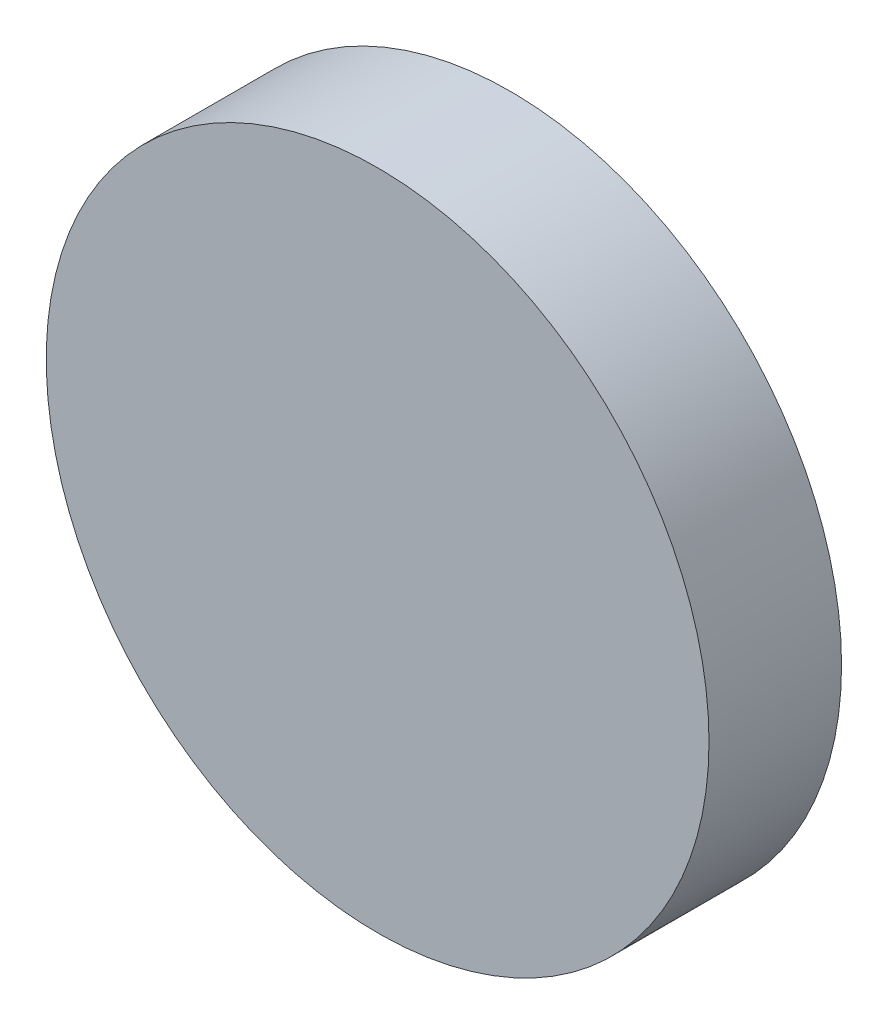
ISO-10303-21;
HEADER;
FILE_DESCRIPTION(('STEP AP214'),'2;1');
FILE_NAME('part.step','',(''),(''),'','','');
FILE_SCHEMA(('AUTOMOTIVE_DESIGN { 1 0 10303 214 1 1 1 1 }'));
ENDSEC;
DATA;
#1=APPLICATION_CONTEXT('core data for automotive mechanical design processes');
#2=APPLICATION_PROTOCOL_DEFINITION('international standard','automotive_design',2000,#1);
#3=PRODUCT_CONTEXT('',#1,'mechanical');
#4=PRODUCT('Part','Part','',(#3));
#5=PRODUCT_RELATED_PRODUCT_CATEGORY('part','',(#4));
#6=PRODUCT_DEFINITION_FORMATION('','',#4);
#7=PRODUCT_DEFINITION_CONTEXT('part definition',#1,'design');
#8=PRODUCT_DEFINITION('design','',#6,#7);
#9=PRODUCT_DEFINITION_SHAPE('','',#8);
#10=(LENGTH_UNIT() NAMED_UNIT(*) SI_UNIT(.MILLI.,.METRE.));
#11=(NAMED_UNIT(*) PLANE_ANGLE_UNIT() SI_UNIT($,.RADIAN.));
#12=(NAMED_UNIT(*) SI_UNIT($,.STERADIAN.) SOLID_ANGLE_UNIT());
#13=UNCERTAINTY_MEASURE_WITH_UNIT(LENGTH_MEASURE(1.E-05),#10,'distance_accuracy_value','');
#14=(GEOMETRIC_REPRESENTATION_CONTEXT(3) GLOBAL_UNCERTAINTY_ASSIGNED_CONTEXT((#13)) GLOBAL_UNIT_ASSIGNED_CONTEXT((#10,
#11,#12)) REPRESENTATION_CONTEXT('',''));
#15=CARTESIAN_POINT('',(0.,0.,0.));
#16=DIRECTION('',(0.,0.,1.));
#17=DIRECTION('',(1.,0.,0.));
#18=AXIS2_PLACEMENT_3D('',#15,#16,#17);
#19=CARTESIAN_POINT('',(0.,0.,2.));
#20=DIRECTION('',(0.,0.,-1.));
#21=DIRECTION('',(-1.,0.,0.));
#22=AXIS2_PLACEMENT_3D('',#19,#20,#21);
#23=CYLINDRICAL_SURFACE('',#22,5.);
#24=CARTESIAN_POINT('',(0.,0.,2.));
#25=DIRECTION('',(0.,0.,1.));
#26=DIRECTION('',(1.,0.,0.));
#27=AXIS2_PLACEMENT_3D('',#24,#25,#26);
#28=CIRCLE('',#27,5.);
#29=CARTESIAN_POINT('',(5.,0.,2.));
#30=VERTEX_POINT('',#29);
#31=EDGE_CURVE('E10',#30,#30,#28,.T.);
#32=ORIENTED_EDGE('',*,*,#31,.F.);
#33=EDGE_LOOP('',(#32));
#34=FACE_BOUND('',#33,.T.);
#35=CARTESIAN_POINT('',(0.,0.,0.));
#36=DIRECTION('',(0.,0.,1.));
#37=DIRECTION('',(1.,0.,0.));
#38=AXIS2_PLACEMENT_3D('',#35,#36,#37);
#39=CIRCLE('',#38,5.);
#40=CARTESIAN_POINT('',(5.,0.,0.));
#41=VERTEX_POINT('',#40);
#42=EDGE_CURVE('E33',#41,#41,#39,.T.);
#43=ORIENTED_EDGE('',*,*,#42,.T.);
#44=EDGE_LOOP('',(#43));
#45=FACE_BOUND('',#44,.T.);
#46=ADVANCED_FACE('F30',(#34,#45),#23,.T.);
#47=CARTESIAN_POINT('',(0.,0.,2.));
#48=DIRECTION('',(0.,0.,1.));
#49=DIRECTION('',(1.,0.,0.));
#50=AXIS2_PLACEMENT_3D('',#47,#48,#49);
#51=PLANE('',#50);
#52=ORIENTED_EDGE('',*,*,#31,.T.);
#53=EDGE_LOOP('',(#52));
#54=FACE_BOUND('',#53,.T.);
#55=ADVANCED_FACE('F45',(#54),#51,.T.);
#56=CARTESIAN_POINT('',(0.,0.,0.));
#57=DIRECTION('',(0.,0.,1.));
#58=DIRECTION('',(1.,0.,0.));
#59=AXIS2_PLACEMENT_3D('',#56,#57,#58);
#60=PLANE('',#59);
#61=ORIENTED_EDGE('',*,*,#42,.F.);
#62=EDGE_LOOP('',(#61));
#63=FACE_BOUND('',#62,.T.);
#64=ADVANCED_FACE('F43',(#63),#60,.F.);
#65=CLOSED_SHELL('',(#46,#55,#64));
#66=MANIFOLD_SOLID_BREP('B2',#65);
#67=ADVANCED_BREP_SHAPE_REPRESENTATION('',(#18,#66),#14);
#68=SHAPE_DEFINITION_REPRESENTATION(#9,#67);
ENDSEC;
END-ISO-10303-21;
